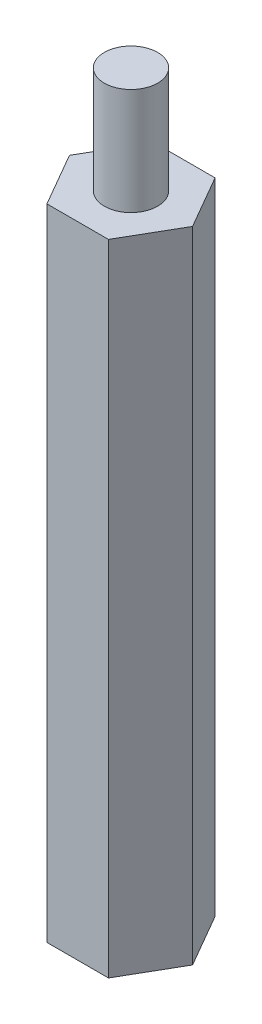
ISO-10303-21;
HEADER;
FILE_DESCRIPTION(('STEP AP214'),'2;1');
FILE_NAME('part.step','',(''),(''),'','','');
FILE_SCHEMA(('AUTOMOTIVE_DESIGN { 1 0 10303 214 1 1 1 1 }'));
ENDSEC;
DATA;
#1=APPLICATION_CONTEXT('core data for automotive mechanical design processes');
#2=APPLICATION_PROTOCOL_DEFINITION('international standard','automotive_design',2000,#1);
#3=PRODUCT_CONTEXT('',#1,'mechanical');
#4=PRODUCT('Part','Part','',(#3));
#5=PRODUCT_RELATED_PRODUCT_CATEGORY('part','',(#4));
#6=PRODUCT_DEFINITION_FORMATION('','',#4);
#7=PRODUCT_DEFINITION_CONTEXT('part definition',#1,'design');
#8=PRODUCT_DEFINITION('design','',#6,#7);
#9=PRODUCT_DEFINITION_SHAPE('','',#8);
#10=(LENGTH_UNIT() NAMED_UNIT(*) SI_UNIT(.MILLI.,.METRE.));
#11=(NAMED_UNIT(*) PLANE_ANGLE_UNIT() SI_UNIT($,.RADIAN.));
#12=(NAMED_UNIT(*) SI_UNIT($,.STERADIAN.) SOLID_ANGLE_UNIT());
#13=UNCERTAINTY_MEASURE_WITH_UNIT(LENGTH_MEASURE(1.E-05),#10,'distance_accuracy_value','');
#14=(GEOMETRIC_REPRESENTATION_CONTEXT(3) GLOBAL_UNCERTAINTY_ASSIGNED_CONTEXT((#13)) GLOBAL_UNIT_ASSIGNED_CONTEXT((#10,
#11,#12)) REPRESENTATION_CONTEXT('',''));
#15=CARTESIAN_POINT('',(0.,0.,0.));
#16=DIRECTION('',(0.,0.,1.));
#17=DIRECTION('',(1.,0.,0.));
#18=AXIS2_PLACEMENT_3D('',#15,#16,#17);
#19=CARTESIAN_POINT('',(-3.66617420935412,76.2,6.35));
#20=DIRECTION('',(0.,0.,-1.));
#21=DIRECTION('',(-1.,0.,0.));
#22=AXIS2_PLACEMENT_3D('',#19,#20,#21);
#23=PLANE('',#22);
#24=DIRECTION('',(1.,0.,0.));
#25=VECTOR('',#24,1.);
#26=CARTESIAN_POINT('',(-3.66617420935412,0.,6.35));
#27=LINE('',#26,#25);
#28=CARTESIAN_POINT('',(-3.66617420935412,0.,6.35));
#29=VERTEX_POINT('',#28);
#30=CARTESIAN_POINT('',(3.66617420935413,0.,6.35));
#31=VERTEX_POINT('',#30);
#32=EDGE_CURVE('E123',#29,#31,#27,.T.);
#33=ORIENTED_EDGE('',*,*,#32,.T.);
#34=DIRECTION('',(0.,-1.,0.));
#35=VECTOR('',#34,1.);
#36=CARTESIAN_POINT('',(3.66617420935413,76.2,6.35));
#37=LINE('',#36,#35);
#38=CARTESIAN_POINT('',(3.66617420935413,76.2,6.35));
#39=VERTEX_POINT('',#38);
#40=EDGE_CURVE('E11',#39,#31,#37,.T.);
#41=ORIENTED_EDGE('',*,*,#40,.F.);
#42=DIRECTION('',(1.,0.,0.));
#43=VECTOR('',#42,1.);
#44=CARTESIAN_POINT('',(-3.66617420935412,76.2,6.35));
#45=LINE('',#44,#43);
#46=CARTESIAN_POINT('',(-3.66617420935412,76.2,6.35));
#47=VERTEX_POINT('',#46);
#48=EDGE_CURVE('E134',#47,#39,#45,.T.);
#49=ORIENTED_EDGE('',*,*,#48,.F.);
#50=DIRECTION('',(0.,-1.,0.));
#51=VECTOR('',#50,1.);
#52=CARTESIAN_POINT('',(-3.66617420935412,76.2,6.35));
#53=LINE('',#52,#51);
#54=EDGE_CURVE('E119',#47,#29,#53,.T.);
#55=ORIENTED_EDGE('',*,*,#54,.T.);
#56=EDGE_LOOP('',(#33,#41,#49,#55));
#57=FACE_BOUND('',#56,.T.);
#58=ADVANCED_FACE('F39',(#57),#23,.F.);
#59=CARTESIAN_POINT('',(3.66617420935413,76.2,6.35));
#60=DIRECTION('',(-0.866025403784439,0.,-0.5));
#61=DIRECTION('',(-0.5,0.,0.866025403784439));
#62=AXIS2_PLACEMENT_3D('',#59,#60,#61);
#63=PLANE('',#62);
#64=DIRECTION('',(0.5,0.,-0.866025403784438));
#65=VECTOR('',#64,1.);
#66=CARTESIAN_POINT('',(3.66617420935413,0.,6.35));
#67=LINE('',#66,#65);
#68=CARTESIAN_POINT('',(7.33234841870825,0.,0.));
#69=VERTEX_POINT('',#68);
#70=EDGE_CURVE('E126',#31,#69,#67,.T.);
#71=ORIENTED_EDGE('',*,*,#70,.T.);
#72=DIRECTION('',(0.,-1.,0.));
#73=VECTOR('',#72,1.);
#74=CARTESIAN_POINT('',(7.33234841870825,76.2,0.));
#75=LINE('',#74,#73);
#76=CARTESIAN_POINT('',(7.33234841870825,76.2,0.));
#77=VERTEX_POINT('',#76);
#78=EDGE_CURVE('E47',#77,#69,#75,.T.);
#79=ORIENTED_EDGE('',*,*,#78,.F.);
#80=DIRECTION('',(0.5,0.,-0.866025403784438));
#81=VECTOR('',#80,1.);
#82=CARTESIAN_POINT('',(3.66617420935413,76.2,6.35));
#83=LINE('',#82,#81);
#84=EDGE_CURVE('E92',#39,#77,#83,.T.);
#85=ORIENTED_EDGE('',*,*,#84,.F.);
#86=ORIENTED_EDGE('',*,*,#40,.T.);
#87=EDGE_LOOP('',(#71,#79,#85,#86));
#88=FACE_BOUND('',#87,.T.);
#89=ADVANCED_FACE('F160',(#88),#63,.F.);
#90=CARTESIAN_POINT('',(7.33234841870825,76.2,0.));
#91=DIRECTION('',(-0.866025403784439,0.,0.5));
#92=DIRECTION('',(0.5,0.,0.866025403784438));
#93=AXIS2_PLACEMENT_3D('',#90,#91,#92);
#94=PLANE('',#93);
#95=DIRECTION('',(-0.5,0.,-0.866025403784438));
#96=VECTOR('',#95,1.);
#97=CARTESIAN_POINT('',(7.33234841870825,0.,0.));
#98=LINE('',#97,#96);
#99=CARTESIAN_POINT('',(3.66617420935412,0.,-6.35));
#100=VERTEX_POINT('',#99);
#101=EDGE_CURVE('E129',#69,#100,#98,.T.);
#102=ORIENTED_EDGE('',*,*,#101,.T.);
#103=DIRECTION('',(0.,-1.,0.));
#104=VECTOR('',#103,1.);
#105=CARTESIAN_POINT('',(3.66617420935412,76.2,-6.35));
#106=LINE('',#105,#104);
#107=CARTESIAN_POINT('',(3.66617420935412,76.2,-6.35));
#108=VERTEX_POINT('',#107);
#109=EDGE_CURVE('E114',#108,#100,#106,.T.);
#110=ORIENTED_EDGE('',*,*,#109,.F.);
#111=DIRECTION('',(-0.5,0.,-0.866025403784438));
#112=VECTOR('',#111,1.);
#113=CARTESIAN_POINT('',(7.33234841870825,76.2,0.));
#114=LINE('',#113,#112);
#115=EDGE_CURVE('E105',#77,#108,#114,.T.);
#116=ORIENTED_EDGE('',*,*,#115,.F.);
#117=ORIENTED_EDGE('',*,*,#78,.T.);
#118=EDGE_LOOP('',(#102,#110,#116,#117));
#119=FACE_BOUND('',#118,.T.);
#120=ADVANCED_FACE('F140',(#119),#94,.F.);
#121=CARTESIAN_POINT('',(3.66617420935412,76.2,-6.35));
#122=DIRECTION('',(0.,0.,1.));
#123=DIRECTION('',(1.,0.,0.));
#124=AXIS2_PLACEMENT_3D('',#121,#122,#123);
#125=PLANE('',#124);
#126=DIRECTION('',(-1.,0.,0.));
#127=VECTOR('',#126,1.);
#128=CARTESIAN_POINT('',(3.66617420935412,0.,-6.35));
#129=LINE('',#128,#127);
#130=CARTESIAN_POINT('',(-3.66617420935413,0.,-6.35));
#131=VERTEX_POINT('',#130);
#132=EDGE_CURVE('E113',#100,#131,#129,.T.);
#133=ORIENTED_EDGE('',*,*,#132,.T.);
#134=DIRECTION('',(0.,-1.,0.));
#135=VECTOR('',#134,1.);
#136=CARTESIAN_POINT('',(-3.66617420935413,76.2,-6.35));
#137=LINE('',#136,#135);
#138=CARTESIAN_POINT('',(-3.66617420935413,76.2,-6.35));
#139=VERTEX_POINT('',#138);
#140=EDGE_CURVE('E110',#139,#131,#137,.T.);
#141=ORIENTED_EDGE('',*,*,#140,.F.);
#142=DIRECTION('',(-1.,0.,0.));
#143=VECTOR('',#142,1.);
#144=CARTESIAN_POINT('',(3.66617420935412,76.2,-6.35));
#145=LINE('',#144,#143);
#146=EDGE_CURVE('E99',#108,#139,#145,.T.);
#147=ORIENTED_EDGE('',*,*,#146,.F.);
#148=ORIENTED_EDGE('',*,*,#109,.T.);
#149=EDGE_LOOP('',(#133,#141,#147,#148));
#150=FACE_BOUND('',#149,.T.);
#151=ADVANCED_FACE('F111',(#150),#125,.F.);
#152=CARTESIAN_POINT('',(-3.66617420935413,76.2,-6.35));
#153=DIRECTION('',(0.866025403784439,0.,0.5));
#154=DIRECTION('',(0.5,0.,-0.866025403784439));
#155=AXIS2_PLACEMENT_3D('',#152,#153,#154);
#156=PLANE('',#155);
#157=DIRECTION('',(-0.5,0.,0.866025403784439));
#158=VECTOR('',#157,1.);
#159=CARTESIAN_POINT('',(-3.66617420935413,0.,-6.35));
#160=LINE('',#159,#158);
#161=CARTESIAN_POINT('',(-7.33234841870825,0.,0.));
#162=VERTEX_POINT('',#161);
#163=EDGE_CURVE('E78',#131,#162,#160,.T.);
#164=ORIENTED_EDGE('',*,*,#163,.T.);
#165=DIRECTION('',(0.,-1.,0.));
#166=VECTOR('',#165,1.);
#167=CARTESIAN_POINT('',(-7.33234841870825,76.2,0.));
#168=LINE('',#167,#166);
#169=CARTESIAN_POINT('',(-7.33234841870825,76.2,0.));
#170=VERTEX_POINT('',#169);
#171=EDGE_CURVE('E115',#170,#162,#168,.T.);
#172=ORIENTED_EDGE('',*,*,#171,.F.);
#173=DIRECTION('',(-0.5,0.,0.866025403784439));
#174=VECTOR('',#173,1.);
#175=CARTESIAN_POINT('',(-3.66617420935413,76.2,-6.35));
#176=LINE('',#175,#174);
#177=EDGE_CURVE('E103',#139,#170,#176,.T.);
#178=ORIENTED_EDGE('',*,*,#177,.F.);
#179=ORIENTED_EDGE('',*,*,#140,.T.);
#180=EDGE_LOOP('',(#164,#172,#178,#179));
#181=FACE_BOUND('',#180,.T.);
#182=ADVANCED_FACE('F117',(#181),#156,.F.);
#183=CARTESIAN_POINT('',(-7.33234841870825,76.2,0.));
#184=DIRECTION('',(0.866025403784439,0.,-0.5));
#185=DIRECTION('',(-0.5,0.,-0.866025403784438));
#186=AXIS2_PLACEMENT_3D('',#183,#184,#185);
#187=PLANE('',#186);
#188=DIRECTION('',(0.5,0.,0.866025403784439));
#189=VECTOR('',#188,1.);
#190=CARTESIAN_POINT('',(-7.33234841870825,0.,0.));
#191=LINE('',#190,#189);
#192=EDGE_CURVE('E84',#162,#29,#191,.T.);
#193=ORIENTED_EDGE('',*,*,#192,.T.);
#194=ORIENTED_EDGE('',*,*,#54,.F.);
#195=DIRECTION('',(0.5,0.,0.866025403784439));
#196=VECTOR('',#195,1.);
#197=CARTESIAN_POINT('',(-7.33234841870825,76.2,0.));
#198=LINE('',#197,#196);
#199=EDGE_CURVE('E55',#170,#47,#198,.T.);
#200=ORIENTED_EDGE('',*,*,#199,.F.);
#201=ORIENTED_EDGE('',*,*,#171,.T.);
#202=EDGE_LOOP('',(#193,#194,#200,#201));
#203=FACE_BOUND('',#202,.T.);
#204=ADVANCED_FACE('F147',(#203),#187,.F.);
#205=CARTESIAN_POINT('',(0.,76.2,0.));
#206=DIRECTION('',(0.,1.,0.));
#207=DIRECTION('',(0.,0.,1.));
#208=AXIS2_PLACEMENT_3D('',#205,#206,#207);
#209=PLANE('',#208);
#210=CARTESIAN_POINT('',(0.,76.2,0.));
#211=DIRECTION('',(0.,1.,0.));
#212=DIRECTION('',(0.,0.,1.));
#213=AXIS2_PLACEMENT_3D('',#210,#211,#212);
#214=CIRCLE('',#213,3.175);
#215=CARTESIAN_POINT('',(0.,76.2,3.175));
#216=VERTEX_POINT('',#215);
#217=EDGE_CURVE('E218',#216,#216,#214,.T.);
#218=ORIENTED_EDGE('',*,*,#217,.F.);
#219=EDGE_LOOP('',(#218));
#220=FACE_BOUND('',#219,.T.);
#221=ORIENTED_EDGE('',*,*,#48,.T.);
#222=ORIENTED_EDGE('',*,*,#84,.T.);
#223=ORIENTED_EDGE('',*,*,#115,.T.);
#224=ORIENTED_EDGE('',*,*,#146,.T.);
#225=ORIENTED_EDGE('',*,*,#177,.T.);
#226=ORIENTED_EDGE('',*,*,#199,.T.);
#227=EDGE_LOOP('',(#221,#222,#223,#224,#225,#226));
#228=FACE_BOUND('',#227,.T.);
#229=ADVANCED_FACE('F101',(#220,#228),#209,.T.);
#230=CARTESIAN_POINT('',(0.,0.,0.));
#231=DIRECTION('',(0.,1.,0.));
#232=DIRECTION('',(0.,0.,1.));
#233=AXIS2_PLACEMENT_3D('',#230,#231,#232);
#234=PLANE('',#233);
#235=ORIENTED_EDGE('',*,*,#32,.F.);
#236=ORIENTED_EDGE('',*,*,#192,.F.);
#237=ORIENTED_EDGE('',*,*,#163,.F.);
#238=ORIENTED_EDGE('',*,*,#132,.F.);
#239=ORIENTED_EDGE('',*,*,#101,.F.);
#240=ORIENTED_EDGE('',*,*,#70,.F.);
#241=EDGE_LOOP('',(#235,#236,#237,#238,#239,#240));
#242=FACE_BOUND('',#241,.T.);
#243=ADVANCED_FACE('F143',(#242),#234,.F.);
#244=CARTESIAN_POINT('',(0.,88.9,0.));
#245=DIRECTION('',(0.,-1.,0.));
#246=DIRECTION('',(0.,0.,-1.));
#247=AXIS2_PLACEMENT_3D('',#244,#245,#246);
#248=CYLINDRICAL_SURFACE('',#247,3.175);
#249=CARTESIAN_POINT('',(0.,88.9,0.));
#250=DIRECTION('',(0.,1.,0.));
#251=DIRECTION('',(0.,0.,1.));
#252=AXIS2_PLACEMENT_3D('',#249,#250,#251);
#253=CIRCLE('',#252,3.175);
#254=CARTESIAN_POINT('',(0.,88.9,3.175));
#255=VERTEX_POINT('',#254);
#256=EDGE_CURVE('E127',#255,#255,#253,.T.);
#257=ORIENTED_EDGE('',*,*,#256,.F.);
#258=EDGE_LOOP('',(#257));
#259=FACE_BOUND('',#258,.T.);
#260=ORIENTED_EDGE('',*,*,#217,.T.);
#261=EDGE_LOOP('',(#260));
#262=FACE_BOUND('',#261,.T.);
#263=ADVANCED_FACE('F191',(#259,#262),#248,.T.);
#264=CARTESIAN_POINT('',(0.,88.9,0.));
#265=DIRECTION('',(0.,1.,0.));
#266=DIRECTION('',(0.,0.,1.));
#267=AXIS2_PLACEMENT_3D('',#264,#265,#266);
#268=PLANE('',#267);
#269=ORIENTED_EDGE('',*,*,#256,.T.);
#270=EDGE_LOOP('',(#269));
#271=FACE_BOUND('',#270,.T.);
#272=ADVANCED_FACE('F202',(#271),#268,.T.);
#273=CLOSED_SHELL('',(#58,#89,#120,#151,#182,#204,#229,#243,#263,#272));
#274=MANIFOLD_SOLID_BREP('B2',#273);
#275=ADVANCED_BREP_SHAPE_REPRESENTATION('',(#18,#274),#14);
#276=SHAPE_DEFINITION_REPRESENTATION(#9,#275);
ENDSEC;
END-ISO-10303-21;
